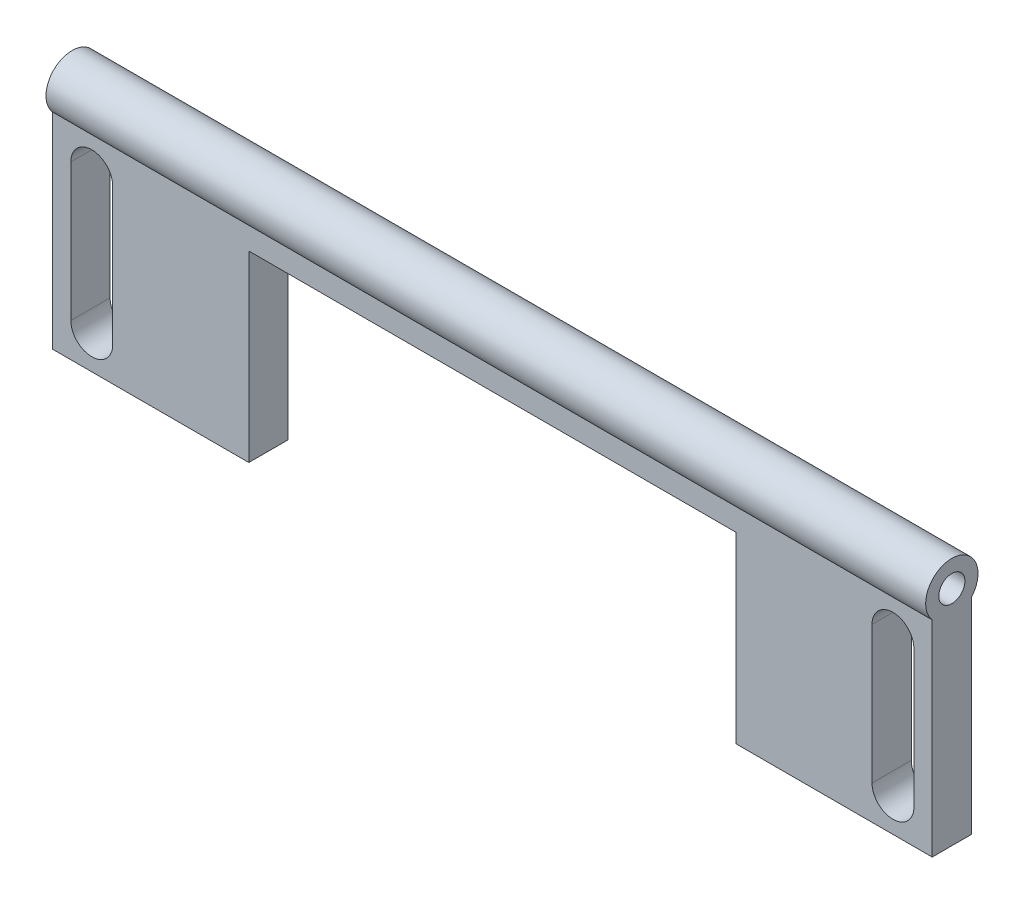
ISO-10303-21;
HEADER;
FILE_DESCRIPTION(('STEP AP214'),'2;1');
FILE_NAME('part.step','',(''),(''),'','','');
FILE_SCHEMA(('AUTOMOTIVE_DESIGN { 1 0 10303 214 1 1 1 1 }'));
ENDSEC;
DATA;
#1=APPLICATION_CONTEXT('core data for automotive mechanical design processes');
#2=APPLICATION_PROTOCOL_DEFINITION('international standard','automotive_design',2000,#1);
#3=PRODUCT_CONTEXT('',#1,'mechanical');
#4=PRODUCT('Part','Part','',(#3));
#5=PRODUCT_RELATED_PRODUCT_CATEGORY('part','',(#4));
#6=PRODUCT_DEFINITION_FORMATION('','',#4);
#7=PRODUCT_DEFINITION_CONTEXT('part definition',#1,'design');
#8=PRODUCT_DEFINITION('design','',#6,#7);
#9=PRODUCT_DEFINITION_SHAPE('','',#8);
#10=(LENGTH_UNIT() NAMED_UNIT(*) SI_UNIT(.MILLI.,.METRE.));
#11=(NAMED_UNIT(*) PLANE_ANGLE_UNIT() SI_UNIT($,.RADIAN.));
#12=(NAMED_UNIT(*) SI_UNIT($,.STERADIAN.) SOLID_ANGLE_UNIT());
#13=UNCERTAINTY_MEASURE_WITH_UNIT(LENGTH_MEASURE(1.E-05),#10,'distance_accuracy_value','');
#14=(GEOMETRIC_REPRESENTATION_CONTEXT(3) GLOBAL_UNCERTAINTY_ASSIGNED_CONTEXT((#13)) GLOBAL_UNIT_ASSIGNED_CONTEXT((#10,
#11,#12)) REPRESENTATION_CONTEXT('',''));
#15=CARTESIAN_POINT('',(0.,0.,0.));
#16=DIRECTION('',(0.,0.,1.));
#17=DIRECTION('',(1.,0.,0.));
#18=AXIS2_PLACEMENT_3D('',#15,#16,#17);
#19=CARTESIAN_POINT('',(33.615,0.,0.));
#20=DIRECTION('',(0.,1.,0.));
#21=DIRECTION('',(0.,0.,1.));
#22=AXIS2_PLACEMENT_3D('',#19,#20,#21);
#23=PLANE('',#22);
#24=DIRECTION('',(-1.,0.,0.));
#25=VECTOR('',#24,1.);
#26=CARTESIAN_POINT('',(33.615,0.,-3.));
#27=LINE('',#26,#25);
#28=CARTESIAN_POINT('',(15.,0.,-3.));
#29=VERTEX_POINT('',#28);
#30=CARTESIAN_POINT('',(0.,0.,-3.));
#31=VERTEX_POINT('',#30);
#32=EDGE_CURVE('E271',#29,#31,#27,.T.);
#33=ORIENTED_EDGE('',*,*,#32,.F.);
#34=DIRECTION('',(0.,0.,1.));
#35=VECTOR('',#34,1.);
#36=CARTESIAN_POINT('',(15.,0.,0.));
#37=LINE('',#36,#35);
#38=CARTESIAN_POINT('',(15.,0.,0.));
#39=VERTEX_POINT('',#38);
#40=EDGE_CURVE('E11',#29,#39,#37,.T.);
#41=ORIENTED_EDGE('',*,*,#40,.T.);
#42=DIRECTION('',(-1.,0.,0.));
#43=VECTOR('',#42,1.);
#44=CARTESIAN_POINT('',(33.615,0.,0.));
#45=LINE('',#44,#43);
#46=CARTESIAN_POINT('',(0.,0.,0.));
#47=VERTEX_POINT('',#46);
#48=EDGE_CURVE('E273',#39,#47,#45,.T.);
#49=ORIENTED_EDGE('',*,*,#48,.T.);
#50=DIRECTION('',(0.,0.,-1.));
#51=VECTOR('',#50,1.);
#52=CARTESIAN_POINT('',(0.,0.,0.));
#53=LINE('',#52,#51);
#54=EDGE_CURVE('E260',#47,#31,#53,.T.);
#55=ORIENTED_EDGE('',*,*,#54,.T.);
#56=EDGE_LOOP('',(#33,#41,#49,#55));
#57=FACE_BOUND('',#56,.T.);
#58=ADVANCED_FACE('F35',(#57),#23,.F.);
#59=CARTESIAN_POINT('',(33.615,0.,0.));
#60=DIRECTION('',(0.,0.,-1.));
#61=DIRECTION('',(0.,1.,0.));
#62=AXIS2_PLACEMENT_3D('',#59,#60,#61);
#63=PLANE('',#62);
#64=ORIENTED_EDGE('',*,*,#48,.F.);
#65=DIRECTION('',(0.,1.,0.));
#66=VECTOR('',#65,1.);
#67=CARTESIAN_POINT('',(15.,0.,0.));
#68=LINE('',#67,#66);
#69=CARTESIAN_POINT('',(15.,14.,0.));
#70=VERTEX_POINT('',#69);
#71=EDGE_CURVE('E174',#39,#70,#68,.T.);
#72=ORIENTED_EDGE('',*,*,#71,.T.);
#73=DIRECTION('',(1.,0.,0.));
#74=VECTOR('',#73,1.);
#75=CARTESIAN_POINT('',(33.615,14.,0.));
#76=LINE('',#75,#74);
#77=CARTESIAN_POINT('',(52.23,14.,0.));
#78=VERTEX_POINT('',#77);
#79=EDGE_CURVE('E177',#70,#78,#76,.T.);
#80=ORIENTED_EDGE('',*,*,#79,.T.);
#81=DIRECTION('',(0.,-1.,0.));
#82=VECTOR('',#81,1.);
#83=CARTESIAN_POINT('',(52.23,0.,0.));
#84=LINE('',#83,#82);
#85=CARTESIAN_POINT('',(52.23,0.,0.));
#86=VERTEX_POINT('',#85);
#87=EDGE_CURVE('E150',#78,#86,#84,.T.);
#88=ORIENTED_EDGE('',*,*,#87,.T.);
#89=CARTESIAN_POINT('',(67.23,0.,0.));
#90=VERTEX_POINT('',#89);
#91=EDGE_CURVE('E274',#90,#86,#45,.T.);
#92=ORIENTED_EDGE('',*,*,#91,.F.);
#93=DIRECTION('',(0.,-1.,0.));
#94=VECTOR('',#93,1.);
#95=CARTESIAN_POINT('',(67.23,0.,0.));
#96=LINE('',#95,#94);
#97=CARTESIAN_POINT('',(67.23,15.7,0.));
#98=VERTEX_POINT('',#97);
#99=EDGE_CURVE('E216',#98,#90,#96,.T.);
#100=ORIENTED_EDGE('',*,*,#99,.F.);
#101=DIRECTION('',(-1.,0.,0.));
#102=VECTOR('',#101,1.);
#103=CARTESIAN_POINT('',(33.615,15.7,0.));
#104=LINE('',#103,#102);
#105=CARTESIAN_POINT('',(0.,15.7,0.));
#106=VERTEX_POINT('',#105);
#107=EDGE_CURVE('E277',#98,#106,#104,.T.);
#108=ORIENTED_EDGE('',*,*,#107,.T.);
#109=DIRECTION('',(0.,-1.,0.));
#110=VECTOR('',#109,1.);
#111=CARTESIAN_POINT('',(0.,0.,0.));
#112=LINE('',#111,#110);
#113=EDGE_CURVE('E257',#106,#47,#112,.T.);
#114=ORIENTED_EDGE('',*,*,#113,.T.);
#115=EDGE_LOOP('',(#64,#72,#80,#88,#92,#100,#108,#114));
#116=FACE_BOUND('',#115,.T.);
#117=DIRECTION('',(0.,1.,0.));
#118=VECTOR('',#117,1.);
#119=CARTESIAN_POINT('',(1.40000000000001,0.,0.));
#120=LINE('',#119,#118);
#121=CARTESIAN_POINT('',(1.4,2.6,0.));
#122=VERTEX_POINT('',#121);
#123=CARTESIAN_POINT('',(1.4,13.1,0.));
#124=VERTEX_POINT('',#123);
#125=EDGE_CURVE('E248',#122,#124,#120,.T.);
#126=ORIENTED_EDGE('',*,*,#125,.T.);
#127=CARTESIAN_POINT('',(3.,13.1,0.));
#128=DIRECTION('',(0.,0.,-1.));
#129=DIRECTION('',(0.,1.,0.));
#130=AXIS2_PLACEMENT_3D('',#127,#128,#129);
#131=CIRCLE('',#130,1.6);
#132=CARTESIAN_POINT('',(4.6,13.1,0.));
#133=VERTEX_POINT('',#132);
#134=EDGE_CURVE('E251',#124,#133,#131,.T.);
#135=ORIENTED_EDGE('',*,*,#134,.T.);
#136=DIRECTION('',(0.,-1.,0.));
#137=VECTOR('',#136,1.);
#138=CARTESIAN_POINT('',(4.6,0.,0.));
#139=LINE('',#138,#137);
#140=CARTESIAN_POINT('',(4.6,2.6,0.));
#141=VERTEX_POINT('',#140);
#142=EDGE_CURVE('E236',#133,#141,#139,.T.);
#143=ORIENTED_EDGE('',*,*,#142,.T.);
#144=CARTESIAN_POINT('',(3.,2.6,0.));
#145=DIRECTION('',(0.,0.,-1.));
#146=DIRECTION('',(0.,1.,0.));
#147=AXIS2_PLACEMENT_3D('',#144,#145,#146);
#148=CIRCLE('',#147,1.6);
#149=EDGE_CURVE('E245',#141,#122,#148,.T.);
#150=ORIENTED_EDGE('',*,*,#149,.T.);
#151=EDGE_LOOP('',(#126,#135,#143,#150));
#152=FACE_BOUND('',#151,.T.);
#153=CARTESIAN_POINT('',(64.23,13.1,0.));
#154=DIRECTION('',(0.,0.,-1.));
#155=DIRECTION('',(0.,1.,0.));
#156=AXIS2_PLACEMENT_3D('',#153,#154,#155);
#157=CIRCLE('',#156,1.6);
#158=CARTESIAN_POINT('',(65.83,13.1,0.));
#159=VERTEX_POINT('',#158);
#160=CARTESIAN_POINT('',(62.63,13.1,0.));
#161=VERTEX_POINT('',#160);
#162=EDGE_CURVE('E205',#159,#161,#157,.F.);
#163=ORIENTED_EDGE('',*,*,#162,.F.);
#164=DIRECTION('',(0.,1.,0.));
#165=VECTOR('',#164,1.);
#166=CARTESIAN_POINT('',(65.83,0.,0.));
#167=LINE('',#166,#165);
#168=CARTESIAN_POINT('',(65.83,2.6,0.));
#169=VERTEX_POINT('',#168);
#170=EDGE_CURVE('E194',#169,#159,#167,.T.);
#171=ORIENTED_EDGE('',*,*,#170,.F.);
#172=CARTESIAN_POINT('',(64.23,2.6,0.));
#173=DIRECTION('',(0.,0.,-1.));
#174=DIRECTION('',(0.,1.,0.));
#175=AXIS2_PLACEMENT_3D('',#172,#173,#174);
#176=CIRCLE('',#175,1.6);
#177=CARTESIAN_POINT('',(62.63,2.6,0.));
#178=VERTEX_POINT('',#177);
#179=EDGE_CURVE('E201',#178,#169,#176,.F.);
#180=ORIENTED_EDGE('',*,*,#179,.F.);
#181=DIRECTION('',(0.,-1.,0.));
#182=VECTOR('',#181,1.);
#183=CARTESIAN_POINT('',(62.63,0.,0.));
#184=LINE('',#183,#182);
#185=EDGE_CURVE('E203',#161,#178,#184,.T.);
#186=ORIENTED_EDGE('',*,*,#185,.F.);
#187=EDGE_LOOP('',(#163,#171,#180,#186));
#188=FACE_BOUND('',#187,.T.);
#189=ADVANCED_FACE('F283',(#116,#152,#188),#63,.F.);
#190=CARTESIAN_POINT('',(33.615,0.,-3.));
#191=DIRECTION('',(0.,0.,1.));
#192=DIRECTION('',(1.,0.,0.));
#193=AXIS2_PLACEMENT_3D('',#190,#191,#192);
#194=PLANE('',#193);
#195=DIRECTION('',(1.,0.,0.));
#196=VECTOR('',#195,1.);
#197=CARTESIAN_POINT('',(52.23,14.,-3.));
#198=LINE('',#197,#196);
#199=CARTESIAN_POINT('',(15.,14.,-3.));
#200=VERTEX_POINT('',#199);
#201=CARTESIAN_POINT('',(52.23,14.,-3.));
#202=VERTEX_POINT('',#201);
#203=EDGE_CURVE('E157',#200,#202,#198,.T.);
#204=ORIENTED_EDGE('',*,*,#203,.F.);
#205=DIRECTION('',(0.,1.,0.));
#206=VECTOR('',#205,1.);
#207=CARTESIAN_POINT('',(15.,14.,-3.));
#208=LINE('',#207,#206);
#209=EDGE_CURVE('E154',#29,#200,#208,.T.);
#210=ORIENTED_EDGE('',*,*,#209,.F.);
#211=ORIENTED_EDGE('',*,*,#32,.T.);
#212=DIRECTION('',(0.,1.,0.));
#213=VECTOR('',#212,1.);
#214=CARTESIAN_POINT('',(0.,0.,-3.));
#215=LINE('',#214,#213);
#216=CARTESIAN_POINT('',(0.,15.7,-3.));
#217=VERTEX_POINT('',#216);
#218=EDGE_CURVE('E263',#31,#217,#215,.T.);
#219=ORIENTED_EDGE('',*,*,#218,.T.);
#220=DIRECTION('',(-1.,0.,0.));
#221=VECTOR('',#220,1.);
#222=CARTESIAN_POINT('',(33.615,15.7,-3.));
#223=LINE('',#222,#221);
#224=CARTESIAN_POINT('',(67.23,15.7,-3.));
#225=VERTEX_POINT('',#224);
#226=EDGE_CURVE('E269',#225,#217,#223,.T.);
#227=ORIENTED_EDGE('',*,*,#226,.F.);
#228=DIRECTION('',(0.,1.,0.));
#229=VECTOR('',#228,1.);
#230=CARTESIAN_POINT('',(67.23,0.,-3.));
#231=LINE('',#230,#229);
#232=CARTESIAN_POINT('',(67.23,0.,-3.));
#233=VERTEX_POINT('',#232);
#234=EDGE_CURVE('E210',#233,#225,#231,.T.);
#235=ORIENTED_EDGE('',*,*,#234,.F.);
#236=CARTESIAN_POINT('',(52.23,0.,-3.));
#237=VERTEX_POINT('',#236);
#238=EDGE_CURVE('E168',#233,#237,#27,.T.);
#239=ORIENTED_EDGE('',*,*,#238,.T.);
#240=DIRECTION('',(0.,-1.,0.));
#241=VECTOR('',#240,1.);
#242=CARTESIAN_POINT('',(52.23,14.,-3.));
#243=LINE('',#242,#241);
#244=EDGE_CURVE('E50',#202,#237,#243,.T.);
#245=ORIENTED_EDGE('',*,*,#244,.F.);
#246=EDGE_LOOP('',(#204,#210,#211,#219,#227,#235,#239,#245));
#247=FACE_BOUND('',#246,.T.);
#248=DIRECTION('',(0.,-1.,0.));
#249=VECTOR('',#248,1.);
#250=CARTESIAN_POINT('',(4.6,13.1,-3.));
#251=LINE('',#250,#249);
#252=CARTESIAN_POINT('',(4.6,13.1,-3.));
#253=VERTEX_POINT('',#252);
#254=CARTESIAN_POINT('',(4.6,2.6,-3.));
#255=VERTEX_POINT('',#254);
#256=EDGE_CURVE('E224',#253,#255,#251,.T.);
#257=ORIENTED_EDGE('',*,*,#256,.F.);
#258=CARTESIAN_POINT('',(3.,13.1,-3.));
#259=DIRECTION('',(0.,0.,-1.));
#260=DIRECTION('',(-1.,0.,0.));
#261=AXIS2_PLACEMENT_3D('',#258,#259,#260);
#262=CIRCLE('',#261,1.6);
#263=CARTESIAN_POINT('',(1.4,13.1,-3.));
#264=VERTEX_POINT('',#263);
#265=EDGE_CURVE('E222',#264,#253,#262,.T.);
#266=ORIENTED_EDGE('',*,*,#265,.F.);
#267=DIRECTION('',(0.,1.,0.));
#268=VECTOR('',#267,1.);
#269=CARTESIAN_POINT('',(1.4,13.1,-3.));
#270=LINE('',#269,#268);
#271=CARTESIAN_POINT('',(1.4,2.6,-3.));
#272=VERTEX_POINT('',#271);
#273=EDGE_CURVE('E230',#272,#264,#270,.T.);
#274=ORIENTED_EDGE('',*,*,#273,.F.);
#275=CARTESIAN_POINT('',(3.,2.6,-3.));
#276=DIRECTION('',(0.,0.,-1.));
#277=DIRECTION('',(-1.,0.,0.));
#278=AXIS2_PLACEMENT_3D('',#275,#276,#277);
#279=CIRCLE('',#278,1.6);
#280=EDGE_CURVE('E227',#255,#272,#279,.T.);
#281=ORIENTED_EDGE('',*,*,#280,.F.);
#282=EDGE_LOOP('',(#257,#266,#274,#281));
#283=FACE_BOUND('',#282,.T.);
#284=CARTESIAN_POINT('',(64.23,13.1,-3.));
#285=DIRECTION('',(0.,0.,1.));
#286=DIRECTION('',(1.,0.,0.));
#287=AXIS2_PLACEMENT_3D('',#284,#285,#286);
#288=CIRCLE('',#287,1.6);
#289=CARTESIAN_POINT('',(65.83,13.1,-3.));
#290=VERTEX_POINT('',#289);
#291=CARTESIAN_POINT('',(62.63,13.1,-3.));
#292=VERTEX_POINT('',#291);
#293=EDGE_CURVE('E179',#290,#292,#288,.T.);
#294=ORIENTED_EDGE('',*,*,#293,.T.);
#295=DIRECTION('',(0.,-1.,0.));
#296=VECTOR('',#295,1.);
#297=CARTESIAN_POINT('',(62.63,13.1,-3.));
#298=LINE('',#297,#296);
#299=CARTESIAN_POINT('',(62.63,2.6,-3.));
#300=VERTEX_POINT('',#299);
#301=EDGE_CURVE('E188',#292,#300,#298,.T.);
#302=ORIENTED_EDGE('',*,*,#301,.T.);
#303=CARTESIAN_POINT('',(64.23,2.6,-3.));
#304=DIRECTION('',(0.,0.,1.));
#305=DIRECTION('',(1.,0.,0.));
#306=AXIS2_PLACEMENT_3D('',#303,#304,#305);
#307=CIRCLE('',#306,1.6);
#308=CARTESIAN_POINT('',(65.83,2.6,-3.));
#309=VERTEX_POINT('',#308);
#310=EDGE_CURVE('E185',#300,#309,#307,.T.);
#311=ORIENTED_EDGE('',*,*,#310,.T.);
#312=DIRECTION('',(0.,1.,0.));
#313=VECTOR('',#312,1.);
#314=CARTESIAN_POINT('',(65.83,13.1,-3.));
#315=LINE('',#314,#313);
#316=EDGE_CURVE('E182',#309,#290,#315,.T.);
#317=ORIENTED_EDGE('',*,*,#316,.T.);
#318=EDGE_LOOP('',(#294,#302,#311,#317));
#319=FACE_BOUND('',#318,.T.);
#320=ADVANCED_FACE('F165',(#247,#283,#319),#194,.F.);
#321=CARTESIAN_POINT('',(33.615,17.0228756555323,-1.5));
#322=DIRECTION('',(-1.,0.,0.));
#323=DIRECTION('',(0.,0.,1.));
#324=AXIS2_PLACEMENT_3D('',#321,#322,#323);
#325=CYLINDRICAL_SURFACE('',#324,2.);
#326=CARTESIAN_POINT('',(0.,17.0228756555323,-1.5));
#327=DIRECTION('',(1.,0.,0.));
#328=DIRECTION('',(0.,0.,-1.));
#329=AXIS2_PLACEMENT_3D('',#326,#327,#328);
#330=CIRCLE('',#329,2.);
#331=EDGE_CURVE('E254',#106,#217,#330,.F.);
#332=ORIENTED_EDGE('',*,*,#331,.F.);
#333=ORIENTED_EDGE('',*,*,#107,.F.);
#334=CARTESIAN_POINT('',(67.23,17.0228756555323,-1.5));
#335=DIRECTION('',(1.,0.,0.));
#336=DIRECTION('',(0.,0.,-1.));
#337=AXIS2_PLACEMENT_3D('',#334,#335,#336);
#338=CIRCLE('',#337,2.);
#339=EDGE_CURVE('E207',#98,#225,#338,.F.);
#340=ORIENTED_EDGE('',*,*,#339,.T.);
#341=ORIENTED_EDGE('',*,*,#226,.T.);
#342=EDGE_LOOP('',(#332,#333,#340,#341));
#343=FACE_BOUND('',#342,.T.);
#344=ADVANCED_FACE('F37',(#343),#325,.T.);
#345=ORIENTED_EDGE('',*,*,#91,.T.);
#346=DIRECTION('',(0.,0.,-1.));
#347=VECTOR('',#346,1.);
#348=CARTESIAN_POINT('',(52.23,0.,0.));
#349=LINE('',#348,#347);
#350=EDGE_CURVE('E43',#86,#237,#349,.T.);
#351=ORIENTED_EDGE('',*,*,#350,.T.);
#352=ORIENTED_EDGE('',*,*,#238,.F.);
#353=DIRECTION('',(0.,0.,-1.));
#354=VECTOR('',#353,1.);
#355=CARTESIAN_POINT('',(67.23,0.,0.));
#356=LINE('',#355,#354);
#357=EDGE_CURVE('E213',#90,#233,#356,.T.);
#358=ORIENTED_EDGE('',*,*,#357,.F.);
#359=EDGE_LOOP('',(#345,#351,#352,#358));
#360=FACE_BOUND('',#359,.T.);
#361=ADVANCED_FACE('F279',(#360),#23,.F.);
#362=CARTESIAN_POINT('',(33.615,17.0228756555323,-1.5));
#363=DIRECTION('',(-1.,0.,0.));
#364=DIRECTION('',(0.,0.,1.));
#365=AXIS2_PLACEMENT_3D('',#362,#363,#364);
#366=CYLINDRICAL_SURFACE('',#365,1.);
#367=CARTESIAN_POINT('',(0.,17.0228756555323,-1.5));
#368=DIRECTION('',(1.,0.,0.));
#369=DIRECTION('',(0.,0.,-1.));
#370=AXIS2_PLACEMENT_3D('',#367,#368,#369);
#371=CIRCLE('',#370,1.);
#372=CARTESIAN_POINT('',(0.,17.0228756555323,-2.5));
#373=VERTEX_POINT('',#372);
#374=EDGE_CURVE('E266',#373,#373,#371,.T.);
#375=ORIENTED_EDGE('',*,*,#374,.F.);
#376=EDGE_LOOP('',(#375));
#377=FACE_BOUND('',#376,.T.);
#378=CARTESIAN_POINT('',(67.23,17.0228756555323,-1.5));
#379=DIRECTION('',(1.,0.,0.));
#380=DIRECTION('',(0.,0.,-1.));
#381=AXIS2_PLACEMENT_3D('',#378,#379,#380);
#382=CIRCLE('',#381,1.);
#383=CARTESIAN_POINT('',(67.23,17.0228756555323,-2.5));
#384=VERTEX_POINT('',#383);
#385=EDGE_CURVE('E219',#384,#384,#382,.T.);
#386=ORIENTED_EDGE('',*,*,#385,.T.);
#387=EDGE_LOOP('',(#386));
#388=FACE_BOUND('',#387,.T.);
#389=ADVANCED_FACE('F308',(#377,#388),#366,.F.);
#390=CARTESIAN_POINT('',(0.,0.,0.));
#391=DIRECTION('',(1.,0.,0.));
#392=DIRECTION('',(0.,0.,-1.));
#393=AXIS2_PLACEMENT_3D('',#390,#391,#392);
#394=PLANE('',#393);
#395=ORIENTED_EDGE('',*,*,#331,.T.);
#396=ORIENTED_EDGE('',*,*,#218,.F.);
#397=ORIENTED_EDGE('',*,*,#54,.F.);
#398=ORIENTED_EDGE('',*,*,#113,.F.);
#399=EDGE_LOOP('',(#395,#396,#397,#398));
#400=FACE_BOUND('',#399,.T.);
#401=ORIENTED_EDGE('',*,*,#374,.T.);
#402=EDGE_LOOP('',(#401));
#403=FACE_BOUND('',#402,.T.);
#404=ADVANCED_FACE('F294',(#400,#403),#394,.F.);
#405=CARTESIAN_POINT('',(3.,13.1,0.5));
#406=DIRECTION('',(0.,0.,-1.));
#407=DIRECTION('',(-1.,0.,0.));
#408=AXIS2_PLACEMENT_3D('',#405,#406,#407);
#409=CYLINDRICAL_SURFACE('',#408,1.6);
#410=DIRECTION('',(0.,0.,-1.));
#411=VECTOR('',#410,1.);
#412=CARTESIAN_POINT('',(1.4,13.1,0.5));
#413=LINE('',#412,#411);
#414=EDGE_CURVE('E234',#124,#264,#413,.T.);
#415=ORIENTED_EDGE('',*,*,#414,.T.);
#416=ORIENTED_EDGE('',*,*,#265,.T.);
#417=DIRECTION('',(0.,0.,-1.));
#418=VECTOR('',#417,1.);
#419=CARTESIAN_POINT('',(4.6,13.1,0.5));
#420=LINE('',#419,#418);
#421=EDGE_CURVE('E233',#133,#253,#420,.T.);
#422=ORIENTED_EDGE('',*,*,#421,.F.);
#423=ORIENTED_EDGE('',*,*,#134,.F.);
#424=EDGE_LOOP('',(#415,#416,#422,#423));
#425=FACE_BOUND('',#424,.T.);
#426=ADVANCED_FACE('F316',(#425),#409,.F.);
#427=CARTESIAN_POINT('',(1.4,13.1,0.5));
#428=DIRECTION('',(-1.,0.,0.));
#429=DIRECTION('',(0.,-1.,0.));
#430=AXIS2_PLACEMENT_3D('',#427,#428,#429);
#431=PLANE('',#430);
#432=DIRECTION('',(0.,0.,-1.));
#433=VECTOR('',#432,1.);
#434=CARTESIAN_POINT('',(1.4,2.6,0.5));
#435=LINE('',#434,#433);
#436=EDGE_CURVE('E237',#122,#272,#435,.T.);
#437=ORIENTED_EDGE('',*,*,#436,.T.);
#438=ORIENTED_EDGE('',*,*,#273,.T.);
#439=ORIENTED_EDGE('',*,*,#414,.F.);
#440=ORIENTED_EDGE('',*,*,#125,.F.);
#441=EDGE_LOOP('',(#437,#438,#439,#440));
#442=FACE_BOUND('',#441,.T.);
#443=ADVANCED_FACE('F385',(#442),#431,.F.);
#444=CARTESIAN_POINT('',(3.,2.6,0.5));
#445=DIRECTION('',(0.,0.,-1.));
#446=DIRECTION('',(-1.,0.,0.));
#447=AXIS2_PLACEMENT_3D('',#444,#445,#446);
#448=CYLINDRICAL_SURFACE('',#447,1.6);
#449=DIRECTION('',(0.,0.,-1.));
#450=VECTOR('',#449,1.);
#451=CARTESIAN_POINT('',(4.6,2.6,0.5));
#452=LINE('',#451,#450);
#453=EDGE_CURVE('E239',#141,#255,#452,.T.);
#454=ORIENTED_EDGE('',*,*,#453,.T.);
#455=ORIENTED_EDGE('',*,*,#280,.T.);
#456=ORIENTED_EDGE('',*,*,#436,.F.);
#457=ORIENTED_EDGE('',*,*,#149,.F.);
#458=EDGE_LOOP('',(#454,#455,#456,#457));
#459=FACE_BOUND('',#458,.T.);
#460=ADVANCED_FACE('F388',(#459),#448,.F.);
#461=CARTESIAN_POINT('',(4.6,13.1,0.5));
#462=DIRECTION('',(1.,0.,0.));
#463=DIRECTION('',(0.,1.,0.));
#464=AXIS2_PLACEMENT_3D('',#461,#462,#463);
#465=PLANE('',#464);
#466=ORIENTED_EDGE('',*,*,#421,.T.);
#467=ORIENTED_EDGE('',*,*,#256,.T.);
#468=ORIENTED_EDGE('',*,*,#453,.F.);
#469=ORIENTED_EDGE('',*,*,#142,.F.);
#470=EDGE_LOOP('',(#466,#467,#468,#469));
#471=FACE_BOUND('',#470,.T.);
#472=ADVANCED_FACE('F304',(#471),#465,.F.);
#473=CARTESIAN_POINT('',(67.23,0.,0.));
#474=DIRECTION('',(-1.,0.,0.));
#475=DIRECTION('',(0.,0.,-1.));
#476=AXIS2_PLACEMENT_3D('',#473,#474,#475);
#477=PLANE('',#476);
#478=ORIENTED_EDGE('',*,*,#339,.F.);
#479=ORIENTED_EDGE('',*,*,#99,.T.);
#480=ORIENTED_EDGE('',*,*,#357,.T.);
#481=ORIENTED_EDGE('',*,*,#234,.T.);
#482=EDGE_LOOP('',(#478,#479,#480,#481));
#483=FACE_BOUND('',#482,.T.);
#484=ORIENTED_EDGE('',*,*,#385,.F.);
#485=EDGE_LOOP('',(#484));
#486=FACE_BOUND('',#485,.T.);
#487=ADVANCED_FACE('F300',(#483,#486),#477,.F.);
#488=CARTESIAN_POINT('',(64.23,13.1,0.5));
#489=DIRECTION('',(0.,0.,-1.));
#490=DIRECTION('',(-1.,0.,0.));
#491=AXIS2_PLACEMENT_3D('',#488,#489,#490);
#492=CYLINDRICAL_SURFACE('',#491,1.6);
#493=ORIENTED_EDGE('',*,*,#162,.T.);
#494=DIRECTION('',(0.,0.,-1.));
#495=VECTOR('',#494,1.);
#496=CARTESIAN_POINT('',(62.63,13.1,0.5));
#497=LINE('',#496,#495);
#498=EDGE_CURVE('E192',#161,#292,#497,.T.);
#499=ORIENTED_EDGE('',*,*,#498,.T.);
#500=ORIENTED_EDGE('',*,*,#293,.F.);
#501=DIRECTION('',(0.,0.,-1.));
#502=VECTOR('',#501,1.);
#503=CARTESIAN_POINT('',(65.83,13.1,0.5));
#504=LINE('',#503,#502);
#505=EDGE_CURVE('E191',#159,#290,#504,.T.);
#506=ORIENTED_EDGE('',*,*,#505,.F.);
#507=EDGE_LOOP('',(#493,#499,#500,#506));
#508=FACE_BOUND('',#507,.T.);
#509=ADVANCED_FACE('F303',(#508),#492,.F.);
#510=CARTESIAN_POINT('',(62.63,13.1,0.5));
#511=DIRECTION('',(1.,0.,0.));
#512=DIRECTION('',(0.,1.,0.));
#513=AXIS2_PLACEMENT_3D('',#510,#511,#512);
#514=PLANE('',#513);
#515=ORIENTED_EDGE('',*,*,#185,.T.);
#516=DIRECTION('',(0.,0.,-1.));
#517=VECTOR('',#516,1.);
#518=CARTESIAN_POINT('',(62.63,2.6,0.5));
#519=LINE('',#518,#517);
#520=EDGE_CURVE('E195',#178,#300,#519,.T.);
#521=ORIENTED_EDGE('',*,*,#520,.T.);
#522=ORIENTED_EDGE('',*,*,#301,.F.);
#523=ORIENTED_EDGE('',*,*,#498,.F.);
#524=EDGE_LOOP('',(#515,#521,#522,#523));
#525=FACE_BOUND('',#524,.T.);
#526=ADVANCED_FACE('F373',(#525),#514,.T.);
#527=CARTESIAN_POINT('',(64.23,2.6,0.5));
#528=DIRECTION('',(0.,0.,-1.));
#529=DIRECTION('',(-1.,0.,0.));
#530=AXIS2_PLACEMENT_3D('',#527,#528,#529);
#531=CYLINDRICAL_SURFACE('',#530,1.6);
#532=ORIENTED_EDGE('',*,*,#179,.T.);
#533=DIRECTION('',(0.,0.,-1.));
#534=VECTOR('',#533,1.);
#535=CARTESIAN_POINT('',(65.83,2.6,0.5));
#536=LINE('',#535,#534);
#537=EDGE_CURVE('E58',#169,#309,#536,.T.);
#538=ORIENTED_EDGE('',*,*,#537,.T.);
#539=ORIENTED_EDGE('',*,*,#310,.F.);
#540=ORIENTED_EDGE('',*,*,#520,.F.);
#541=EDGE_LOOP('',(#532,#538,#539,#540));
#542=FACE_BOUND('',#541,.T.);
#543=ADVANCED_FACE('F376',(#542),#531,.F.);
#544=CARTESIAN_POINT('',(65.83,13.1,0.5));
#545=DIRECTION('',(-1.,0.,0.));
#546=DIRECTION('',(0.,-1.,0.));
#547=AXIS2_PLACEMENT_3D('',#544,#545,#546);
#548=PLANE('',#547);
#549=ORIENTED_EDGE('',*,*,#170,.T.);
#550=ORIENTED_EDGE('',*,*,#505,.T.);
#551=ORIENTED_EDGE('',*,*,#316,.F.);
#552=ORIENTED_EDGE('',*,*,#537,.F.);
#553=EDGE_LOOP('',(#549,#550,#551,#552));
#554=FACE_BOUND('',#553,.T.);
#555=ADVANCED_FACE('F350',(#554),#548,.T.);
#556=CARTESIAN_POINT('',(52.23,14.,7.));
#557=DIRECTION('',(0.,1.,0.));
#558=DIRECTION('',(0.,0.,1.));
#559=AXIS2_PLACEMENT_3D('',#556,#557,#558);
#560=PLANE('',#559);
#561=DIRECTION('',(0.,0.,-1.));
#562=VECTOR('',#561,1.);
#563=CARTESIAN_POINT('',(15.,14.,7.));
#564=LINE('',#563,#562);
#565=EDGE_CURVE('E153',#70,#200,#564,.T.);
#566=ORIENTED_EDGE('',*,*,#565,.T.);
#567=ORIENTED_EDGE('',*,*,#203,.T.);
#568=DIRECTION('',(0.,0.,-1.));
#569=VECTOR('',#568,1.);
#570=CARTESIAN_POINT('',(52.23,14.,7.));
#571=LINE('',#570,#569);
#572=EDGE_CURVE('E146',#78,#202,#571,.T.);
#573=ORIENTED_EDGE('',*,*,#572,.F.);
#574=ORIENTED_EDGE('',*,*,#79,.F.);
#575=EDGE_LOOP('',(#566,#567,#573,#574));
#576=FACE_BOUND('',#575,.T.);
#577=ADVANCED_FACE('F158',(#576),#560,.F.);
#578=CARTESIAN_POINT('',(15.,14.,7.));
#579=DIRECTION('',(-1.,0.,0.));
#580=DIRECTION('',(0.,0.,1.));
#581=AXIS2_PLACEMENT_3D('',#578,#579,#580);
#582=PLANE('',#581);
#583=ORIENTED_EDGE('',*,*,#40,.F.);
#584=ORIENTED_EDGE('',*,*,#209,.T.);
#585=ORIENTED_EDGE('',*,*,#565,.F.);
#586=ORIENTED_EDGE('',*,*,#71,.F.);
#587=EDGE_LOOP('',(#583,#584,#585,#586));
#588=FACE_BOUND('',#587,.T.);
#589=ADVANCED_FACE('F287',(#588),#582,.F.);
#590=CARTESIAN_POINT('',(52.23,14.,7.));
#591=DIRECTION('',(1.,0.,0.));
#592=DIRECTION('',(0.,0.,-1.));
#593=AXIS2_PLACEMENT_3D('',#590,#591,#592);
#594=PLANE('',#593);
#595=ORIENTED_EDGE('',*,*,#572,.T.);
#596=ORIENTED_EDGE('',*,*,#244,.T.);
#597=ORIENTED_EDGE('',*,*,#350,.F.);
#598=ORIENTED_EDGE('',*,*,#87,.F.);
#599=EDGE_LOOP('',(#595,#596,#597,#598));
#600=FACE_BOUND('',#599,.T.);
#601=ADVANCED_FACE('F148',(#600),#594,.F.);
#602=CLOSED_SHELL('',(#58,#189,#320,#344,#361,#389,#404,#426,#443,#460,#472,#487,#509,#526,#543,
#555,#577,#589,#601));
#603=MANIFOLD_SOLID_BREP('B2',#602);
#604=ADVANCED_BREP_SHAPE_REPRESENTATION('',(#18,#603),#14);
#605=SHAPE_DEFINITION_REPRESENTATION(#9,#604);
ENDSEC;
END-ISO-10303-21;
